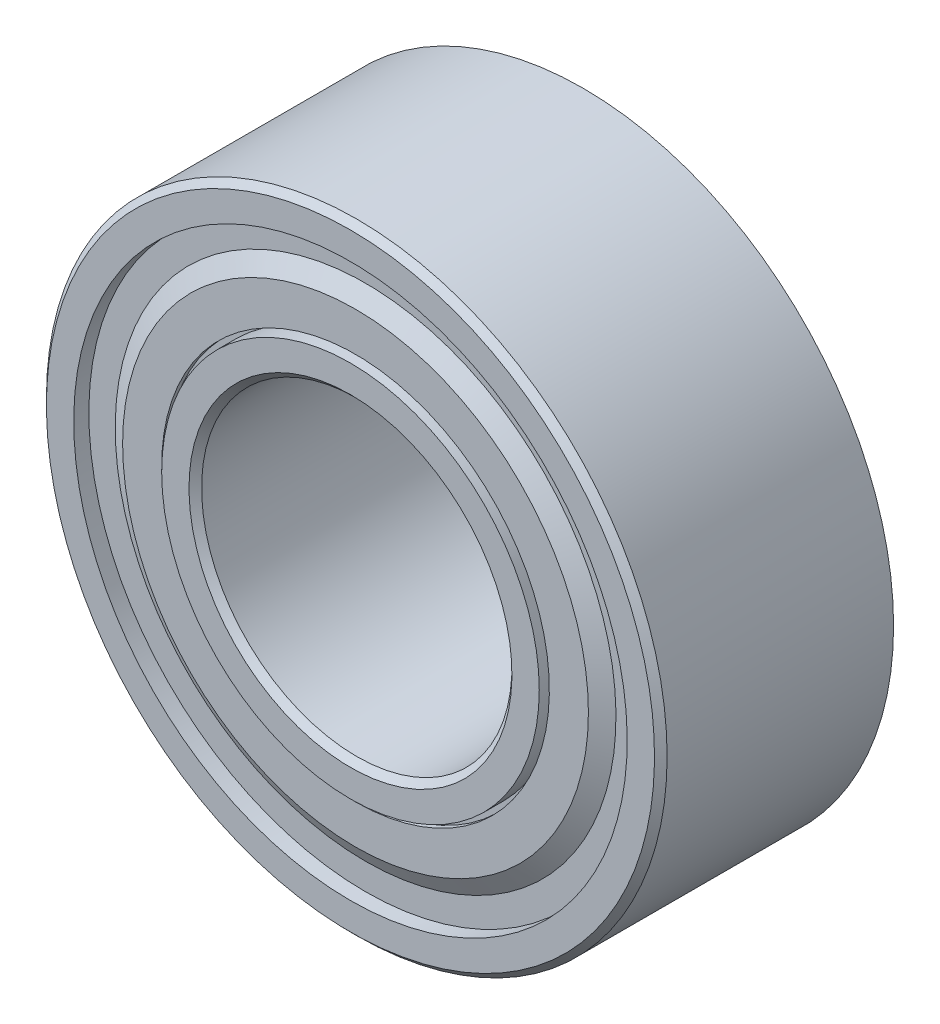
ISO-10303-21;
HEADER;
FILE_DESCRIPTION(('STEP AP214'),'2;1');
FILE_NAME('part.step','',(''),(''),'','','');
FILE_SCHEMA(('AUTOMOTIVE_DESIGN { 1 0 10303 214 1 1 1 1 }'));
ENDSEC;
DATA;
#1=APPLICATION_CONTEXT('core data for automotive mechanical design processes');
#2=APPLICATION_PROTOCOL_DEFINITION('international standard','automotive_design',2000,#1);
#3=PRODUCT_CONTEXT('',#1,'mechanical');
#4=PRODUCT('Part','Part','',(#3));
#5=PRODUCT_RELATED_PRODUCT_CATEGORY('part','',(#4));
#6=PRODUCT_DEFINITION_FORMATION('','',#4);
#7=PRODUCT_DEFINITION_CONTEXT('part definition',#1,'design');
#8=PRODUCT_DEFINITION('design','',#6,#7);
#9=PRODUCT_DEFINITION_SHAPE('','',#8);
#10=(LENGTH_UNIT() NAMED_UNIT(*) SI_UNIT(.MILLI.,.METRE.));
#11=(NAMED_UNIT(*) PLANE_ANGLE_UNIT() SI_UNIT($,.RADIAN.));
#12=(NAMED_UNIT(*) SI_UNIT($,.STERADIAN.) SOLID_ANGLE_UNIT());
#13=UNCERTAINTY_MEASURE_WITH_UNIT(LENGTH_MEASURE(1.E-05),#10,'distance_accuracy_value','');
#14=(GEOMETRIC_REPRESENTATION_CONTEXT(3) GLOBAL_UNCERTAINTY_ASSIGNED_CONTEXT((#13)) GLOBAL_UNIT_ASSIGNED_CONTEXT((#10,
#11,#12)) REPRESENTATION_CONTEXT('',''));
#15=CARTESIAN_POINT('',(0.,0.,0.));
#16=DIRECTION('',(0.,0.,1.));
#17=DIRECTION('',(1.,0.,0.));
#18=AXIS2_PLACEMENT_3D('',#15,#16,#17);
#19=CARTESIAN_POINT('',(0.,0.,0.));
#20=DIRECTION('',(0.,0.,1.));
#21=DIRECTION('',(0.,-1.,0.));
#22=AXIS2_PLACEMENT_3D('',#19,#20,#21);
#23=CYLINDRICAL_SURFACE('',#22,3.56666666666667);
#24=CARTESIAN_POINT('',(0.,0.,-1.24));
#25=DIRECTION('',(0.,0.,1.));
#26=DIRECTION('',(0.,-1.,0.));
#27=AXIS2_PLACEMENT_3D('',#24,#25,#26);
#28=CIRCLE('',#27,3.56666666666667);
#29=CARTESIAN_POINT('',(0.,-3.56666666666667,-1.24));
#30=VERTEX_POINT('',#29);
#31=EDGE_CURVE('E84',#30,#30,#28,.T.);
#32=ORIENTED_EDGE('',*,*,#31,.F.);
#33=EDGE_LOOP('',(#32));
#34=FACE_BOUND('',#33,.T.);
#35=CARTESIAN_POINT('',(0.,0.,-1.305));
#36=DIRECTION('',(0.,0.,1.));
#37=DIRECTION('',(0.,-1.,0.));
#38=AXIS2_PLACEMENT_3D('',#35,#36,#37);
#39=CIRCLE('',#38,3.56666666666667);
#40=CARTESIAN_POINT('',(0.,-3.56666666666667,-1.305));
#41=VERTEX_POINT('',#40);
#42=EDGE_CURVE('E12',#41,#41,#39,.T.);
#43=ORIENTED_EDGE('',*,*,#42,.T.);
#44=EDGE_LOOP('',(#43));
#45=FACE_BOUND('',#44,.T.);
#46=ADVANCED_FACE('F56',(#34,#45),#23,.T.);
#47=CARTESIAN_POINT('',(0.,3.56666666666667,-1.305));
#48=DIRECTION('',(0.,0.,1.));
#49=DIRECTION('',(0.,-1.,0.));
#50=AXIS2_PLACEMENT_3D('',#47,#48,#49);
#51=PLANE('',#50);
#52=ORIENTED_EDGE('',*,*,#42,.F.);
#53=EDGE_LOOP('',(#52));
#54=FACE_BOUND('',#53,.T.);
#55=CARTESIAN_POINT('',(0.,0.,-1.305));
#56=DIRECTION('',(0.,0.,1.));
#57=DIRECTION('',(0.,-1.,0.));
#58=AXIS2_PLACEMENT_3D('',#55,#56,#57);
#59=CIRCLE('',#58,3.22694050703183);
#60=CARTESIAN_POINT('',(0.,-3.22694050703183,-1.305));
#61=VERTEX_POINT('',#60);
#62=EDGE_CURVE('E62',#61,#61,#59,.T.);
#63=ORIENTED_EDGE('',*,*,#62,.T.);
#64=EDGE_LOOP('',(#63));
#65=FACE_BOUND('',#64,.T.);
#66=ADVANCED_FACE('F91',(#54,#65),#51,.F.);
#67=CARTESIAN_POINT('',(0.,0.,-1.435));
#68=DIRECTION('',(0.,0.,1.));
#69=DIRECTION('',(0.,-1.,0.));
#70=AXIS2_PLACEMENT_3D('',#67,#68,#69);
#71=CONICAL_SURFACE('',#70,3.00177390204788,1.0471975511966);
#72=ORIENTED_EDGE('',*,*,#62,.F.);
#73=EDGE_LOOP('',(#72));
#74=FACE_BOUND('',#73,.T.);
#75=CARTESIAN_POINT('',(0.,0.,-1.435));
#76=DIRECTION('',(0.,0.,1.));
#77=DIRECTION('',(0.,-1.,0.));
#78=AXIS2_PLACEMENT_3D('',#75,#76,#77);
#79=CIRCLE('',#78,3.00177390204788);
#80=CARTESIAN_POINT('',(0.,-3.00177390204788,-1.435));
#81=VERTEX_POINT('',#80);
#82=EDGE_CURVE('E66',#81,#81,#79,.T.);
#83=ORIENTED_EDGE('',*,*,#82,.T.);
#84=EDGE_LOOP('',(#83));
#85=FACE_BOUND('',#84,.T.);
#86=ADVANCED_FACE('F95',(#74,#85),#71,.T.);
#87=CARTESIAN_POINT('',(0.,3.00177390204788,-1.435));
#88=DIRECTION('',(0.,0.,1.));
#89=DIRECTION('',(0.,-1.,0.));
#90=AXIS2_PLACEMENT_3D('',#87,#88,#89);
#91=PLANE('',#90);
#92=ORIENTED_EDGE('',*,*,#82,.F.);
#93=EDGE_LOOP('',(#92));
#94=FACE_BOUND('',#93,.T.);
#95=CARTESIAN_POINT('',(0.,0.,-1.435));
#96=DIRECTION('',(0.,0.,1.));
#97=DIRECTION('',(0.,-1.,0.));
#98=AXIS2_PLACEMENT_3D('',#95,#96,#97);
#99=CIRCLE('',#98,2.49833333333333);
#100=CARTESIAN_POINT('',(0.,-2.49833333333333,-1.435));
#101=VERTEX_POINT('',#100);
#102=EDGE_CURVE('E70',#101,#101,#99,.T.);
#103=ORIENTED_EDGE('',*,*,#102,.T.);
#104=EDGE_LOOP('',(#103));
#105=FACE_BOUND('',#104,.T.);
#106=ADVANCED_FACE('F100',(#94,#105),#91,.F.);
#107=CARTESIAN_POINT('',(0.,0.,0.));
#108=DIRECTION('',(0.,0.,1.));
#109=DIRECTION('',(0.,-1.,0.));
#110=AXIS2_PLACEMENT_3D('',#107,#108,#109);
#111=CYLINDRICAL_SURFACE('',#110,2.49833333333333);
#112=ORIENTED_EDGE('',*,*,#102,.F.);
#113=EDGE_LOOP('',(#112));
#114=FACE_BOUND('',#113,.T.);
#115=CARTESIAN_POINT('',(0.,0.,-1.37));
#116=DIRECTION('',(0.,0.,1.));
#117=DIRECTION('',(0.,-1.,0.));
#118=AXIS2_PLACEMENT_3D('',#115,#116,#117);
#119=CIRCLE('',#118,2.49833333333333);
#120=CARTESIAN_POINT('',(0.,-2.49833333333333,-1.37));
#121=VERTEX_POINT('',#120);
#122=EDGE_CURVE('E75',#121,#121,#119,.T.);
#123=ORIENTED_EDGE('',*,*,#122,.T.);
#124=EDGE_LOOP('',(#123));
#125=FACE_BOUND('',#124,.T.);
#126=ADVANCED_FACE('F106',(#114,#125),#111,.F.);
#127=CARTESIAN_POINT('',(0.,2.98435720453986,-1.37));
#128=DIRECTION('',(0.,0.,-1.));
#129=DIRECTION('',(0.,1.,0.));
#130=AXIS2_PLACEMENT_3D('',#127,#128,#129);
#131=PLANE('',#130);
#132=ORIENTED_EDGE('',*,*,#122,.F.);
#133=EDGE_LOOP('',(#132));
#134=FACE_BOUND('',#133,.T.);
#135=CARTESIAN_POINT('',(0.,0.,-1.37));
#136=DIRECTION('',(0.,0.,1.));
#137=DIRECTION('',(0.,-1.,0.));
#138=AXIS2_PLACEMENT_3D('',#135,#136,#137);
#139=CIRCLE('',#138,2.98435720453986);
#140=CARTESIAN_POINT('',(0.,-2.98435720453986,-1.37));
#141=VERTEX_POINT('',#140);
#142=EDGE_CURVE('E78',#141,#141,#139,.T.);
#143=ORIENTED_EDGE('',*,*,#142,.T.);
#144=EDGE_LOOP('',(#143));
#145=FACE_BOUND('',#144,.T.);
#146=ADVANCED_FACE('F110',(#134,#145),#131,.F.);
#147=CARTESIAN_POINT('',(0.,0.,-1.24));
#148=DIRECTION('',(0.,0.,1.));
#149=DIRECTION('',(0.,-1.,0.));
#150=AXIS2_PLACEMENT_3D('',#147,#148,#149);
#151=CONICAL_SURFACE('',#150,3.20952380952381,1.0471975511966);
#152=ORIENTED_EDGE('',*,*,#142,.F.);
#153=EDGE_LOOP('',(#152));
#154=FACE_BOUND('',#153,.T.);
#155=CARTESIAN_POINT('',(0.,0.,-1.24));
#156=DIRECTION('',(0.,0.,1.));
#157=DIRECTION('',(0.,-1.,0.));
#158=AXIS2_PLACEMENT_3D('',#155,#156,#157);
#159=CIRCLE('',#158,3.20952380952381);
#160=CARTESIAN_POINT('',(0.,-3.20952380952381,-1.24));
#161=VERTEX_POINT('',#160);
#162=EDGE_CURVE('E81',#161,#161,#159,.T.);
#163=ORIENTED_EDGE('',*,*,#162,.T.);
#164=EDGE_LOOP('',(#163));
#165=FACE_BOUND('',#164,.T.);
#166=ADVANCED_FACE('F114',(#154,#165),#151,.F.);
#167=CARTESIAN_POINT('',(0.,3.56666666666667,-1.24));
#168=DIRECTION('',(0.,0.,-1.));
#169=DIRECTION('',(0.,1.,0.));
#170=AXIS2_PLACEMENT_3D('',#167,#168,#169);
#171=PLANE('',#170);
#172=ORIENTED_EDGE('',*,*,#162,.F.);
#173=EDGE_LOOP('',(#172));
#174=FACE_BOUND('',#173,.T.);
#175=ORIENTED_EDGE('',*,*,#31,.T.);
#176=EDGE_LOOP('',(#175));
#177=FACE_BOUND('',#176,.T.);
#178=ADVANCED_FACE('F88',(#174,#177),#171,.F.);
#179=CLOSED_SHELL('',(#46,#66,#86,#106,#126,#146,#166,#178));
#180=MANIFOLD_SOLID_BREP('B2',#179);
#181=CARTESIAN_POINT('',(0.,0.,0.));
#182=DIRECTION('',(0.,0.,1.));
#183=DIRECTION('',(0.,-1.,0.));
#184=AXIS2_PLACEMENT_3D('',#181,#182,#183);
#185=CYLINDRICAL_SURFACE('',#184,3.56666666666667);
#186=CARTESIAN_POINT('',(0.,0.,1.305));
#187=DIRECTION('',(0.,0.,1.));
#188=DIRECTION('',(0.,-1.,0.));
#189=AXIS2_PLACEMENT_3D('',#186,#187,#188);
#190=CIRCLE('',#189,3.56666666666667);
#191=CARTESIAN_POINT('',(0.,-3.56666666666667,1.305));
#192=VERTEX_POINT('',#191);
#193=EDGE_CURVE('E55',#192,#192,#190,.T.);
#194=ORIENTED_EDGE('',*,*,#193,.F.);
#195=EDGE_LOOP('',(#194));
#196=FACE_BOUND('',#195,.T.);
#197=CARTESIAN_POINT('',(0.,0.,1.24));
#198=DIRECTION('',(0.,0.,1.));
#199=DIRECTION('',(0.,-1.,0.));
#200=AXIS2_PLACEMENT_3D('',#197,#198,#199);
#201=CIRCLE('',#200,3.56666666666667);
#202=CARTESIAN_POINT('',(0.,-3.56666666666667,1.24));
#203=VERTEX_POINT('',#202);
#204=EDGE_CURVE('E212',#203,#203,#201,.T.);
#205=ORIENTED_EDGE('',*,*,#204,.T.);
#206=EDGE_LOOP('',(#205));
#207=FACE_BOUND('',#206,.T.);
#208=ADVANCED_FACE('F184',(#196,#207),#185,.T.);
#209=CARTESIAN_POINT('',(0.,3.56666666666667,1.305));
#210=DIRECTION('',(0.,0.,-1.));
#211=DIRECTION('',(0.,1.,0.));
#212=AXIS2_PLACEMENT_3D('',#209,#210,#211);
#213=PLANE('',#212);
#214=CARTESIAN_POINT('',(0.,0.,1.305));
#215=DIRECTION('',(0.,0.,1.));
#216=DIRECTION('',(0.,-1.,0.));
#217=AXIS2_PLACEMENT_3D('',#214,#215,#216);
#218=CIRCLE('',#217,3.22694050703183);
#219=CARTESIAN_POINT('',(0.,-3.22694050703183,1.305));
#220=VERTEX_POINT('',#219);
#221=EDGE_CURVE('E190',#220,#220,#218,.T.);
#222=ORIENTED_EDGE('',*,*,#221,.F.);
#223=EDGE_LOOP('',(#222));
#224=FACE_BOUND('',#223,.T.);
#225=ORIENTED_EDGE('',*,*,#193,.T.);
#226=EDGE_LOOP('',(#225));
#227=FACE_BOUND('',#226,.T.);
#228=ADVANCED_FACE('F249',(#224,#227),#213,.F.);
#229=CARTESIAN_POINT('',(0.,0.,1.305));
#230=DIRECTION('',(0.,0.,-1.));
#231=DIRECTION('',(0.,1.,0.));
#232=AXIS2_PLACEMENT_3D('',#229,#230,#231);
#233=CONICAL_SURFACE('',#232,3.22694050703183,1.0471975511966);
#234=CARTESIAN_POINT('',(0.,0.,1.435));
#235=DIRECTION('',(0.,0.,1.));
#236=DIRECTION('',(0.,-1.,0.));
#237=AXIS2_PLACEMENT_3D('',#234,#235,#236);
#238=CIRCLE('',#237,3.00177390204788);
#239=CARTESIAN_POINT('',(0.,-3.00177390204788,1.435));
#240=VERTEX_POINT('',#239);
#241=EDGE_CURVE('E194',#240,#240,#238,.T.);
#242=ORIENTED_EDGE('',*,*,#241,.F.);
#243=EDGE_LOOP('',(#242));
#244=FACE_BOUND('',#243,.T.);
#245=ORIENTED_EDGE('',*,*,#221,.T.);
#246=EDGE_LOOP('',(#245));
#247=FACE_BOUND('',#246,.T.);
#248=ADVANCED_FACE('F244',(#244,#247),#233,.T.);
#249=CARTESIAN_POINT('',(0.,3.00177390204788,1.435));
#250=DIRECTION('',(0.,0.,-1.));
#251=DIRECTION('',(0.,1.,0.));
#252=AXIS2_PLACEMENT_3D('',#249,#250,#251);
#253=PLANE('',#252);
#254=CARTESIAN_POINT('',(0.,0.,1.435));
#255=DIRECTION('',(0.,0.,1.));
#256=DIRECTION('',(0.,-1.,0.));
#257=AXIS2_PLACEMENT_3D('',#254,#255,#256);
#258=CIRCLE('',#257,2.49833333333333);
#259=CARTESIAN_POINT('',(0.,-2.49833333333333,1.435));
#260=VERTEX_POINT('',#259);
#261=EDGE_CURVE('E198',#260,#260,#258,.T.);
#262=ORIENTED_EDGE('',*,*,#261,.F.);
#263=EDGE_LOOP('',(#262));
#264=FACE_BOUND('',#263,.T.);
#265=ORIENTED_EDGE('',*,*,#241,.T.);
#266=EDGE_LOOP('',(#265));
#267=FACE_BOUND('',#266,.T.);
#268=ADVANCED_FACE('F238',(#264,#267),#253,.F.);
#269=CARTESIAN_POINT('',(0.,0.,0.));
#270=DIRECTION('',(0.,0.,1.));
#271=DIRECTION('',(0.,-1.,0.));
#272=AXIS2_PLACEMENT_3D('',#269,#270,#271);
#273=CYLINDRICAL_SURFACE('',#272,2.49833333333333);
#274=CARTESIAN_POINT('',(0.,0.,1.37));
#275=DIRECTION('',(0.,0.,1.));
#276=DIRECTION('',(0.,-1.,0.));
#277=AXIS2_PLACEMENT_3D('',#274,#275,#276);
#278=CIRCLE('',#277,2.49833333333333);
#279=CARTESIAN_POINT('',(0.,-2.49833333333333,1.37));
#280=VERTEX_POINT('',#279);
#281=EDGE_CURVE('E203',#280,#280,#278,.T.);
#282=ORIENTED_EDGE('',*,*,#281,.F.);
#283=EDGE_LOOP('',(#282));
#284=FACE_BOUND('',#283,.T.);
#285=ORIENTED_EDGE('',*,*,#261,.T.);
#286=EDGE_LOOP('',(#285));
#287=FACE_BOUND('',#286,.T.);
#288=ADVANCED_FACE('F232',(#284,#287),#273,.F.);
#289=CARTESIAN_POINT('',(0.,2.98435720453986,1.37));
#290=DIRECTION('',(0.,0.,1.));
#291=DIRECTION('',(0.,-1.,0.));
#292=AXIS2_PLACEMENT_3D('',#289,#290,#291);
#293=PLANE('',#292);
#294=CARTESIAN_POINT('',(0.,0.,1.37));
#295=DIRECTION('',(0.,0.,1.));
#296=DIRECTION('',(0.,-1.,0.));
#297=AXIS2_PLACEMENT_3D('',#294,#295,#296);
#298=CIRCLE('',#297,2.98435720453986);
#299=CARTESIAN_POINT('',(0.,-2.98435720453986,1.37));
#300=VERTEX_POINT('',#299);
#301=EDGE_CURVE('E206',#300,#300,#298,.T.);
#302=ORIENTED_EDGE('',*,*,#301,.F.);
#303=EDGE_LOOP('',(#302));
#304=FACE_BOUND('',#303,.T.);
#305=ORIENTED_EDGE('',*,*,#281,.T.);
#306=EDGE_LOOP('',(#305));
#307=FACE_BOUND('',#306,.T.);
#308=ADVANCED_FACE('F226',(#304,#307),#293,.F.);
#309=CARTESIAN_POINT('',(0.,0.,1.37));
#310=DIRECTION('',(0.,0.,-1.));
#311=DIRECTION('',(0.,1.,0.));
#312=AXIS2_PLACEMENT_3D('',#309,#310,#311);
#313=CONICAL_SURFACE('',#312,2.98435720453986,1.0471975511966);
#314=CARTESIAN_POINT('',(0.,0.,1.24));
#315=DIRECTION('',(0.,0.,1.));
#316=DIRECTION('',(0.,-1.,0.));
#317=AXIS2_PLACEMENT_3D('',#314,#315,#316);
#318=CIRCLE('',#317,3.20952380952381);
#319=CARTESIAN_POINT('',(0.,-3.20952380952381,1.24));
#320=VERTEX_POINT('',#319);
#321=EDGE_CURVE('E209',#320,#320,#318,.T.);
#322=ORIENTED_EDGE('',*,*,#321,.F.);
#323=EDGE_LOOP('',(#322));
#324=FACE_BOUND('',#323,.T.);
#325=ORIENTED_EDGE('',*,*,#301,.T.);
#326=EDGE_LOOP('',(#325));
#327=FACE_BOUND('',#326,.T.);
#328=ADVANCED_FACE('F220',(#324,#327),#313,.F.);
#329=CARTESIAN_POINT('',(0.,3.56666666666667,1.24));
#330=DIRECTION('',(0.,0.,1.));
#331=DIRECTION('',(0.,-1.,0.));
#332=AXIS2_PLACEMENT_3D('',#329,#330,#331);
#333=PLANE('',#332);
#334=ORIENTED_EDGE('',*,*,#204,.F.);
#335=EDGE_LOOP('',(#334));
#336=FACE_BOUND('',#335,.T.);
#337=ORIENTED_EDGE('',*,*,#321,.T.);
#338=EDGE_LOOP('',(#337));
#339=FACE_BOUND('',#338,.T.);
#340=ADVANCED_FACE('F217',(#336,#339),#333,.F.);
#341=CLOSED_SHELL('',(#208,#228,#248,#268,#288,#308,#328,#340));
#342=MANIFOLD_SOLID_BREP('B7',#341);
#343=CARTESIAN_POINT('',(-1.49999999999997,2.59807621135334,0.));
#344=DIRECTION('',(-0.499999999999989,0.866025403784445,0.));
#345=DIRECTION('',(0.866025403784445,0.499999999999989,0.));
#346=AXIS2_PLACEMENT_3D('',#343,#344,#345);
#347=SPHERICAL_SURFACE('',#346,0.6);
#348=CARTESIAN_POINT('',(-1.79999999999996,3.117691453624,0.));
#349=VERTEX_POINT('',#348);
#350=VERTEX_LOOP('',#349);
#351=FACE_BOUND('',#350,.T.);
#352=ADVANCED_FACE('F312',(#351),#347,.T.);
#353=CLOSED_SHELL('',(#352));
#354=MANIFOLD_SOLID_BREP('B50',#353);
#355=CARTESIAN_POINT('',(-2.5980762113533,1.50000000000003,0.));
#356=DIRECTION('',(-0.866025403784433,0.50000000000001,0.));
#357=DIRECTION('',(0.50000000000001,0.866025403784433,0.));
#358=AXIS2_PLACEMENT_3D('',#355,#356,#357);
#359=SPHERICAL_SURFACE('',#358,0.6);
#360=CARTESIAN_POINT('',(-3.11769145362396,1.80000000000004,0.));
#361=VERTEX_POINT('',#360);
#362=VERTEX_LOOP('',#361);
#363=FACE_BOUND('',#362,.T.);
#364=ADVANCED_FACE('F331',(#363),#359,.T.);
#365=CLOSED_SHELL('',(#364));
#366=MANIFOLD_SOLID_BREP('B180',#365);
#367=CARTESIAN_POINT('',(-3.,0.,0.));
#368=DIRECTION('',(-1.,0.,0.));
#369=DIRECTION('',(0.,1.,0.));
#370=AXIS2_PLACEMENT_3D('',#367,#368,#369);
#371=SPHERICAL_SURFACE('',#370,0.6);
#372=CARTESIAN_POINT('',(-3.6,0.,0.));
#373=VERTEX_POINT('',#372);
#374=VERTEX_LOOP('',#373);
#375=FACE_BOUND('',#374,.T.);
#376=ADVANCED_FACE('F350',(#375),#371,.T.);
#377=CLOSED_SHELL('',(#376));
#378=MANIFOLD_SOLID_BREP('B308',#377);
#379=CARTESIAN_POINT('',(-2.59807621135333,-1.49999999999998,0.));
#380=DIRECTION('',(-0.866025403784443,-0.499999999999992,0.));
#381=DIRECTION('',(-0.499999999999992,0.866025403784443,0.));
#382=AXIS2_PLACEMENT_3D('',#379,#380,#381);
#383=SPHERICAL_SURFACE('',#382,0.6);
#384=CARTESIAN_POINT('',(-3.117691453624,-1.79999999999997,0.));
#385=VERTEX_POINT('',#384);
#386=VERTEX_LOOP('',#385);
#387=FACE_BOUND('',#386,.T.);
#388=ADVANCED_FACE('F369',(#387),#383,.T.);
#389=CLOSED_SHELL('',(#388));
#390=MANIFOLD_SOLID_BREP('B327',#389);
#391=CARTESIAN_POINT('',(-1.50000000000002,-2.5980762113533,0.));
#392=DIRECTION('',(-0.500000000000007,-0.866025403784435,0.));
#393=DIRECTION('',(-0.866025403784435,0.500000000000007,0.));
#394=AXIS2_PLACEMENT_3D('',#391,#392,#393);
#395=SPHERICAL_SURFACE('',#394,0.6);
#396=CARTESIAN_POINT('',(-1.80000000000003,-3.11769145362396,0.));
#397=VERTEX_POINT('',#396);
#398=VERTEX_LOOP('',#397);
#399=FACE_BOUND('',#398,.T.);
#400=ADVANCED_FACE('F388',(#399),#395,.T.);
#401=CLOSED_SHELL('',(#400));
#402=MANIFOLD_SOLID_BREP('B346',#401);
#403=CARTESIAN_POINT('',(0.,-3.,0.));
#404=DIRECTION('',(0.,-1.,0.));
#405=DIRECTION('',(-1.,0.,0.));
#406=AXIS2_PLACEMENT_3D('',#403,#404,#405);
#407=SPHERICAL_SURFACE('',#406,0.6);
#408=CARTESIAN_POINT('',(0.,-3.6,0.));
#409=VERTEX_POINT('',#408);
#410=VERTEX_LOOP('',#409);
#411=FACE_BOUND('',#410,.T.);
#412=ADVANCED_FACE('F407',(#411),#407,.T.);
#413=CLOSED_SHELL('',(#412));
#414=MANIFOLD_SOLID_BREP('B365',#413);
#415=CARTESIAN_POINT('',(1.49999999999998,-2.59807621135332,0.));
#416=DIRECTION('',(0.499999999999995,-0.866025403784442,0.));
#417=DIRECTION('',(-0.866025403784442,-0.499999999999995,0.));
#418=AXIS2_PLACEMENT_3D('',#415,#416,#417);
#419=SPHERICAL_SURFACE('',#418,0.6);
#420=CARTESIAN_POINT('',(1.79999999999998,-3.11769145362399,0.));
#421=VERTEX_POINT('',#420);
#422=VERTEX_LOOP('',#421);
#423=FACE_BOUND('',#422,.T.);
#424=ADVANCED_FACE('F426',(#423),#419,.T.);
#425=CLOSED_SHELL('',(#424));
#426=MANIFOLD_SOLID_BREP('B384',#425);
#427=CARTESIAN_POINT('',(2.59807621135331,-1.50000000000001,0.));
#428=DIRECTION('',(0.866025403784436,-0.500000000000004,0.));
#429=DIRECTION('',(-0.500000000000004,-0.866025403784436,0.));
#430=AXIS2_PLACEMENT_3D('',#427,#428,#429);
#431=SPHERICAL_SURFACE('',#430,0.6);
#432=CARTESIAN_POINT('',(3.11769145362397,-1.80000000000001,0.));
#433=VERTEX_POINT('',#432);
#434=VERTEX_LOOP('',#433);
#435=FACE_BOUND('',#434,.T.);
#436=ADVANCED_FACE('F445',(#435),#431,.T.);
#437=CLOSED_SHELL('',(#436));
#438=MANIFOLD_SOLID_BREP('B403',#437);
#439=CARTESIAN_POINT('',(3.,0.,0.));
#440=DIRECTION('',(1.,0.,0.));
#441=DIRECTION('',(0.,-1.,0.));
#442=AXIS2_PLACEMENT_3D('',#439,#440,#441);
#443=SPHERICAL_SURFACE('',#442,0.6);
#444=CARTESIAN_POINT('',(3.6,0.,0.));
#445=VERTEX_POINT('',#444);
#446=VERTEX_LOOP('',#445);
#447=FACE_BOUND('',#446,.T.);
#448=ADVANCED_FACE('F464',(#447),#443,.T.);
#449=CLOSED_SHELL('',(#448));
#450=MANIFOLD_SOLID_BREP('B422',#449);
#451=CARTESIAN_POINT('',(2.59807621135332,1.49999999999999,0.));
#452=DIRECTION('',(0.86602540378444,0.499999999999998,0.));
#453=DIRECTION('',(0.499999999999998,-0.86602540378444,0.));
#454=AXIS2_PLACEMENT_3D('',#451,#452,#453);
#455=SPHERICAL_SURFACE('',#454,0.6);
#456=CARTESIAN_POINT('',(3.11769145362398,1.79999999999999,0.));
#457=VERTEX_POINT('',#456);
#458=VERTEX_LOOP('',#457);
#459=FACE_BOUND('',#458,.T.);
#460=ADVANCED_FACE('F483',(#459),#455,.T.);
#461=CLOSED_SHELL('',(#460));
#462=MANIFOLD_SOLID_BREP('B441',#461);
#463=CARTESIAN_POINT('',(1.5,2.59807621135331,0.));
#464=DIRECTION('',(0.500000000000001,0.866025403784438,0.));
#465=DIRECTION('',(0.866025403784438,-0.500000000000001,0.));
#466=AXIS2_PLACEMENT_3D('',#463,#464,#465);
#467=SPHERICAL_SURFACE('',#466,0.6);
#468=CARTESIAN_POINT('',(1.8,3.11769145362398,0.));
#469=VERTEX_POINT('',#468);
#470=VERTEX_LOOP('',#469);
#471=FACE_BOUND('',#470,.T.);
#472=ADVANCED_FACE('F502',(#471),#467,.T.);
#473=CLOSED_SHELL('',(#472));
#474=MANIFOLD_SOLID_BREP('B460',#473);
#475=CARTESIAN_POINT('',(0.,3.,0.));
#476=DIRECTION('',(0.,1.,0.));
#477=DIRECTION('',(1.,0.,0.));
#478=AXIS2_PLACEMENT_3D('',#475,#476,#477);
#479=SPHERICAL_SURFACE('',#478,0.6);
#480=CARTESIAN_POINT('',(0.,3.6,0.));
#481=VERTEX_POINT('',#480);
#482=VERTEX_LOOP('',#481);
#483=FACE_BOUND('',#482,.T.);
#484=ADVANCED_FACE('F523',(#483),#479,.T.);
#485=CLOSED_SHELL('',(#484));
#486=MANIFOLD_SOLID_BREP('B479',#485);
#487=CARTESIAN_POINT('',(0.,0.,-0.634834957055046));
#488=DIRECTION('',(0.,0.,1.));
#489=DIRECTION('',(0.,-1.,0.));
#490=AXIS2_PLACEMENT_3D('',#487,#488,#489);
#491=PLANE('',#490);
#492=CARTESIAN_POINT('',(0.,0.,-0.634834957055046));
#493=DIRECTION('',(0.,0.,1.));
#494=DIRECTION('',(0.,-1.,0.));
#495=AXIS2_PLACEMENT_3D('',#492,#493,#494);
#496=CIRCLE('',#495,2.65);
#497=CARTESIAN_POINT('',(0.,-2.65,-0.634834957055046));
#498=VERTEX_POINT('',#497);
#499=EDGE_CURVE('E597',#498,#498,#496,.T.);
#500=ORIENTED_EDGE('',*,*,#499,.F.);
#501=EDGE_LOOP('',(#500));
#502=FACE_BOUND('',#501,.T.);
#503=CARTESIAN_POINT('',(0.,0.,-0.634834957055046));
#504=DIRECTION('',(0.,0.,1.));
#505=DIRECTION('',(0.,-1.,0.));
#506=AXIS2_PLACEMENT_3D('',#503,#504,#505);
#507=CIRCLE('',#506,3.35);
#508=CARTESIAN_POINT('',(0.,-3.35,-0.634834957055046));
#509=VERTEX_POINT('',#508);
#510=EDGE_CURVE('E541',#509,#509,#507,.T.);
#511=ORIENTED_EDGE('',*,*,#510,.T.);
#512=EDGE_LOOP('',(#511));
#513=FACE_BOUND('',#512,.T.);
#514=ADVANCED_FACE('F537',(#502,#513),#491,.T.);
#515=CARTESIAN_POINT('',(0.,0.,0.));
#516=DIRECTION('',(0.,0.,1.));
#517=DIRECTION('',(0.,-1.,0.));
#518=AXIS2_PLACEMENT_3D('',#515,#516,#517);
#519=CYLINDRICAL_SURFACE('',#518,2.65);
#520=CARTESIAN_POINT('',(0.,0.,0.487339717240448));
#521=DIRECTION('',(0.,0.,1.));
#522=DIRECTION('',(0.,-1.,0.));
#523=AXIS2_PLACEMENT_3D('',#520,#521,#522);
#524=CIRCLE('',#523,2.65);
#525=CARTESIAN_POINT('',(0.,-2.65,0.487339717240448));
#526=VERTEX_POINT('',#525);
#527=EDGE_CURVE('E565',#526,#526,#524,.T.);
#528=ORIENTED_EDGE('',*,*,#527,.T.);
#529=EDGE_LOOP('',(#528));
#530=FACE_BOUND('',#529,.T.);
#531=CARTESIAN_POINT('',(0.,0.,1.24));
#532=DIRECTION('',(0.,0.,1.));
#533=DIRECTION('',(0.,-1.,0.));
#534=AXIS2_PLACEMENT_3D('',#531,#532,#533);
#535=CIRCLE('',#534,2.65);
#536=CARTESIAN_POINT('',(0.,-2.65,1.24));
#537=VERTEX_POINT('',#536);
#538=EDGE_CURVE('E589',#537,#537,#535,.T.);
#539=ORIENTED_EDGE('',*,*,#538,.F.);
#540=EDGE_LOOP('',(#539));
#541=FACE_BOUND('',#540,.T.);
#542=ADVANCED_FACE('F670',(#530,#541),#519,.T.);
#543=CARTESIAN_POINT('',(0.,2.,1.5));
#544=DIRECTION('',(0.,0.,-1.));
#545=DIRECTION('',(0.,1.,0.));
#546=AXIS2_PLACEMENT_3D('',#543,#544,#545);
#547=PLANE('',#546);
#548=CARTESIAN_POINT('',(0.,0.,1.5));
#549=DIRECTION('',(0.,0.,-1.));
#550=DIRECTION('',(0.,1.,0.));
#551=AXIS2_PLACEMENT_3D('',#548,#549,#550);
#552=CIRCLE('',#551,2.08125);
#553=CARTESIAN_POINT('',(0.,2.08125,1.5));
#554=VERTEX_POINT('',#553);
#555=EDGE_CURVE('E522',#554,#554,#552,.T.);
#556=ORIENTED_EDGE('',*,*,#555,.T.);
#557=EDGE_LOOP('',(#556));
#558=FACE_BOUND('',#557,.T.);
#559=CARTESIAN_POINT('',(0.,0.,1.5));
#560=DIRECTION('',(0.,0.,1.));
#561=DIRECTION('',(0.,-1.,0.));
#562=AXIS2_PLACEMENT_3D('',#559,#560,#561);
#563=CIRCLE('',#562,2.43333333333333);
#564=CARTESIAN_POINT('',(0.,-2.43333333333333,1.5));
#565=VERTEX_POINT('',#564);
#566=EDGE_CURVE('E581',#565,#565,#563,.T.);
#567=ORIENTED_EDGE('',*,*,#566,.T.);
#568=EDGE_LOOP('',(#567));
#569=FACE_BOUND('',#568,.T.);
#570=ADVANCED_FACE('F678',(#558,#569),#547,.F.);
#571=CARTESIAN_POINT('',(0.,0.,0.));
#572=DIRECTION('',(0.,0.,1.));
#573=DIRECTION('',(0.,-1.,0.));
#574=AXIS2_PLACEMENT_3D('',#571,#572,#573);
#575=CYLINDRICAL_SURFACE('',#574,2.65);
#576=ORIENTED_EDGE('',*,*,#499,.T.);
#577=EDGE_LOOP('',(#576));
#578=FACE_BOUND('',#577,.T.);
#579=CARTESIAN_POINT('',(0.,0.,-0.487339717240449));
#580=DIRECTION('',(0.,0.,1.));
#581=DIRECTION('',(0.,-1.,0.));
#582=AXIS2_PLACEMENT_3D('',#579,#580,#581);
#583=CIRCLE('',#582,2.65);
#584=CARTESIAN_POINT('',(0.,-2.65,-0.487339717240449));
#585=VERTEX_POINT('',#584);
#586=EDGE_CURVE('E561',#585,#585,#583,.T.);
#587=ORIENTED_EDGE('',*,*,#586,.F.);
#588=EDGE_LOOP('',(#587));
#589=FACE_BOUND('',#588,.T.);
#590=ADVANCED_FACE('F720',(#578,#589),#575,.T.);
#591=CARTESIAN_POINT('',(0.,0.,0.));
#592=DIRECTION('',(0.,0.,1.));
#593=DIRECTION('',(0.,-1.,0.));
#594=AXIS2_PLACEMENT_3D('',#591,#592,#593);
#595=TOROIDAL_SURFACE('',#594,3.,0.6);
#596=ORIENTED_EDGE('',*,*,#527,.F.);
#597=EDGE_LOOP('',(#596));
#598=FACE_BOUND('',#597,.T.);
#599=ORIENTED_EDGE('',*,*,#586,.T.);
#600=EDGE_LOOP('',(#599));
#601=FACE_BOUND('',#600,.T.);
#602=ADVANCED_FACE('F717',(#598,#601),#595,.F.);
#603=CARTESIAN_POINT('',(0.,0.,0.));
#604=DIRECTION('',(0.,0.,1.));
#605=DIRECTION('',(0.,-1.,0.));
#606=AXIS2_PLACEMENT_3D('',#603,#604,#605);
#607=CYLINDRICAL_SURFACE('',#606,2.);
#608=CARTESIAN_POINT('',(0.,0.,1.41875));
#609=DIRECTION('',(0.,0.,-1.));
#610=DIRECTION('',(0.,1.,0.));
#611=AXIS2_PLACEMENT_3D('',#608,#609,#610);
#612=CIRCLE('',#611,2.);
#613=CARTESIAN_POINT('',(0.,2.,1.41875));
#614=VERTEX_POINT('',#613);
#615=EDGE_CURVE('E551',#614,#614,#612,.F.);
#616=ORIENTED_EDGE('',*,*,#615,.T.);
#617=EDGE_LOOP('',(#616));
#618=FACE_BOUND('',#617,.T.);
#619=CARTESIAN_POINT('',(0.,0.,-1.41875));
#620=DIRECTION('',(0.,0.,1.));
#621=DIRECTION('',(0.,-1.,0.));
#622=AXIS2_PLACEMENT_3D('',#619,#620,#621);
#623=CIRCLE('',#622,2.);
#624=CARTESIAN_POINT('',(0.,-2.,-1.41875));
#625=VERTEX_POINT('',#624);
#626=EDGE_CURVE('E546',#625,#625,#623,.F.);
#627=ORIENTED_EDGE('',*,*,#626,.T.);
#628=EDGE_LOOP('',(#627));
#629=FACE_BOUND('',#628,.T.);
#630=ADVANCED_FACE('F715',(#618,#629),#607,.F.);
#631=CARTESIAN_POINT('',(0.,0.,1.41875));
#632=DIRECTION('',(0.,0.,1.));
#633=DIRECTION('',(0.,-1.,0.));
#634=AXIS2_PLACEMENT_3D('',#631,#632,#633);
#635=CONICAL_SURFACE('',#634,2.,0.78539816339745);
#636=ORIENTED_EDGE('',*,*,#555,.F.);
#637=EDGE_LOOP('',(#636));
#638=FACE_BOUND('',#637,.T.);
#639=ORIENTED_EDGE('',*,*,#615,.F.);
#640=EDGE_LOOP('',(#639));
#641=FACE_BOUND('',#640,.T.);
#642=ADVANCED_FACE('F539',(#638,#641),#635,.F.);
#643=CARTESIAN_POINT('',(0.,0.,0.));
#644=DIRECTION('',(0.,0.,1.));
#645=DIRECTION('',(0.,-1.,0.));
#646=AXIS2_PLACEMENT_3D('',#643,#644,#645);
#647=CYLINDRICAL_SURFACE('',#646,2.43333333333333);
#648=CARTESIAN_POINT('',(0.,0.,1.24));
#649=DIRECTION('',(0.,0.,1.));
#650=DIRECTION('',(0.,-1.,0.));
#651=AXIS2_PLACEMENT_3D('',#648,#649,#650);
#652=CIRCLE('',#651,2.43333333333333);
#653=CARTESIAN_POINT('',(0.,-2.43333333333333,1.24));
#654=VERTEX_POINT('',#653);
#655=EDGE_CURVE('E585',#654,#654,#652,.T.);
#656=ORIENTED_EDGE('',*,*,#655,.T.);
#657=EDGE_LOOP('',(#656));
#658=FACE_BOUND('',#657,.T.);
#659=ORIENTED_EDGE('',*,*,#566,.F.);
#660=EDGE_LOOP('',(#659));
#661=FACE_BOUND('',#660,.T.);
#662=ADVANCED_FACE('F697',(#658,#661),#647,.T.);
#663=CARTESIAN_POINT('',(0.,2.65,1.24));
#664=DIRECTION('',(0.,0.,1.));
#665=DIRECTION('',(0.,-1.,0.));
#666=AXIS2_PLACEMENT_3D('',#663,#664,#665);
#667=PLANE('',#666);
#668=ORIENTED_EDGE('',*,*,#538,.T.);
#669=EDGE_LOOP('',(#668));
#670=FACE_BOUND('',#669,.T.);
#671=ORIENTED_EDGE('',*,*,#655,.F.);
#672=EDGE_LOOP('',(#671));
#673=FACE_BOUND('',#672,.T.);
#674=ADVANCED_FACE('F693',(#670,#673),#667,.T.);
#675=CARTESIAN_POINT('',(0.,3.35,1.24));
#676=DIRECTION('',(0.,0.,1.));
#677=DIRECTION('',(0.,-1.,0.));
#678=AXIS2_PLACEMENT_3D('',#675,#676,#677);
#679=PLANE('',#678);
#680=CARTESIAN_POINT('',(0.,0.,1.24));
#681=DIRECTION('',(0.,0.,1.));
#682=DIRECTION('',(0.,-1.,0.));
#683=AXIS2_PLACEMENT_3D('',#680,#681,#682);
#684=CIRCLE('',#683,3.56666666666667);
#685=CARTESIAN_POINT('',(0.,-3.56666666666667,1.24));
#686=VERTEX_POINT('',#685);
#687=EDGE_CURVE('E625',#686,#686,#684,.T.);
#688=ORIENTED_EDGE('',*,*,#687,.T.);
#689=EDGE_LOOP('',(#688));
#690=FACE_BOUND('',#689,.T.);
#691=CARTESIAN_POINT('',(0.,0.,1.24));
#692=DIRECTION('',(0.,0.,1.));
#693=DIRECTION('',(0.,-1.,0.));
#694=AXIS2_PLACEMENT_3D('',#691,#692,#693);
#695=CIRCLE('',#694,3.35);
#696=CARTESIAN_POINT('',(0.,-3.35,1.24));
#697=VERTEX_POINT('',#696);
#698=EDGE_CURVE('E629',#697,#697,#695,.T.);
#699=ORIENTED_EDGE('',*,*,#698,.F.);
#700=EDGE_LOOP('',(#699));
#701=FACE_BOUND('',#700,.T.);
#702=ADVANCED_FACE('F696',(#690,#701),#679,.T.);
#703=CARTESIAN_POINT('',(0.,0.,0.));
#704=DIRECTION('',(0.,0.,1.));
#705=DIRECTION('',(0.,-1.,0.));
#706=AXIS2_PLACEMENT_3D('',#703,#704,#705);
#707=CYLINDRICAL_SURFACE('',#706,3.56666666666667);
#708=CARTESIAN_POINT('',(0.,0.,1.5));
#709=DIRECTION('',(0.,0.,1.));
#710=DIRECTION('',(0.,-1.,0.));
#711=AXIS2_PLACEMENT_3D('',#708,#709,#710);
#712=CIRCLE('',#711,3.56666666666667);
#713=CARTESIAN_POINT('',(0.,-3.56666666666667,1.5));
#714=VERTEX_POINT('',#713);
#715=EDGE_CURVE('E621',#714,#714,#712,.T.);
#716=ORIENTED_EDGE('',*,*,#715,.T.);
#717=EDGE_LOOP('',(#716));
#718=FACE_BOUND('',#717,.T.);
#719=ORIENTED_EDGE('',*,*,#687,.F.);
#720=EDGE_LOOP('',(#719));
#721=FACE_BOUND('',#720,.T.);
#722=ADVANCED_FACE('F837',(#718,#721),#707,.F.);
#723=CARTESIAN_POINT('',(0.,0.,1.5));
#724=DIRECTION('',(0.,0.,-1.));
#725=DIRECTION('',(0.,1.,0.));
#726=AXIS2_PLACEMENT_3D('',#723,#724,#725);
#727=CONICAL_SURFACE('',#726,3.91875,0.785398163397447);
#728=CARTESIAN_POINT('',(0.,0.,1.41875));
#729=DIRECTION('',(0.,0.,-1.));
#730=DIRECTION('',(0.,1.,0.));
#731=AXIS2_PLACEMENT_3D('',#728,#729,#730);
#732=CIRCLE('',#731,4.);
#733=CARTESIAN_POINT('',(0.,4.,1.41875));
#734=VERTEX_POINT('',#733);
#735=EDGE_CURVE('E605',#734,#734,#732,.T.);
#736=ORIENTED_EDGE('',*,*,#735,.F.);
#737=EDGE_LOOP('',(#736));
#738=FACE_BOUND('',#737,.T.);
#739=CARTESIAN_POINT('',(0.,0.,1.5));
#740=DIRECTION('',(0.,0.,-1.));
#741=DIRECTION('',(0.,1.,0.));
#742=AXIS2_PLACEMENT_3D('',#739,#740,#741);
#743=CIRCLE('',#742,3.91875);
#744=CARTESIAN_POINT('',(0.,3.91875,1.5));
#745=VERTEX_POINT('',#744);
#746=EDGE_CURVE('E609',#745,#745,#743,.F.);
#747=ORIENTED_EDGE('',*,*,#746,.F.);
#748=EDGE_LOOP('',(#747));
#749=FACE_BOUND('',#748,.T.);
#750=ADVANCED_FACE('F684',(#738,#749),#727,.T.);
#751=CARTESIAN_POINT('',(0.,0.,0.));
#752=DIRECTION('',(0.,0.,1.));
#753=DIRECTION('',(0.,-1.,0.));
#754=AXIS2_PLACEMENT_3D('',#751,#752,#753);
#755=TOROIDAL_SURFACE('',#754,3.,0.6);
#756=CARTESIAN_POINT('',(0.,0.,-0.487339717240449));
#757=DIRECTION('',(0.,0.,1.));
#758=DIRECTION('',(0.,-1.,0.));
#759=AXIS2_PLACEMENT_3D('',#756,#757,#758);
#760=CIRCLE('',#759,3.35);
#761=CARTESIAN_POINT('',(0.,-3.35,-0.48733971724045));
#762=VERTEX_POINT('',#761);
#763=EDGE_CURVE('E613',#762,#762,#760,.T.);
#764=ORIENTED_EDGE('',*,*,#763,.F.);
#765=EDGE_LOOP('',(#764));
#766=FACE_BOUND('',#765,.T.);
#767=CARTESIAN_POINT('',(0.,0.,0.487339717240448));
#768=DIRECTION('',(0.,0.,1.));
#769=DIRECTION('',(0.,-1.,0.));
#770=AXIS2_PLACEMENT_3D('',#767,#768,#769);
#771=CIRCLE('',#770,3.35);
#772=CARTESIAN_POINT('',(0.,-3.35,0.487339717240448));
#773=VERTEX_POINT('',#772);
#774=EDGE_CURVE('E617',#773,#773,#771,.T.);
#775=ORIENTED_EDGE('',*,*,#774,.T.);
#776=EDGE_LOOP('',(#775));
#777=FACE_BOUND('',#776,.T.);
#778=ADVANCED_FACE('F820',(#766,#777),#755,.F.);
#779=CARTESIAN_POINT('',(0.,4.,1.5));
#780=DIRECTION('',(0.,0.,-1.));
#781=DIRECTION('',(0.,1.,0.));
#782=AXIS2_PLACEMENT_3D('',#779,#780,#781);
#783=PLANE('',#782);
#784=ORIENTED_EDGE('',*,*,#746,.T.);
#785=EDGE_LOOP('',(#784));
#786=FACE_BOUND('',#785,.T.);
#787=ORIENTED_EDGE('',*,*,#715,.F.);
#788=EDGE_LOOP('',(#787));
#789=FACE_BOUND('',#788,.T.);
#790=ADVANCED_FACE('F811',(#786,#789),#783,.F.);
#791=CARTESIAN_POINT('',(0.,0.,0.));
#792=DIRECTION('',(0.,0.,1.));
#793=DIRECTION('',(0.,-1.,0.));
#794=AXIS2_PLACEMENT_3D('',#791,#792,#793);
#795=CYLINDRICAL_SURFACE('',#794,3.35);
#796=ORIENTED_EDGE('',*,*,#774,.F.);
#797=EDGE_LOOP('',(#796));
#798=FACE_BOUND('',#797,.T.);
#799=ORIENTED_EDGE('',*,*,#698,.T.);
#800=EDGE_LOOP('',(#799));
#801=FACE_BOUND('',#800,.T.);
#802=ADVANCED_FACE('F804',(#798,#801),#795,.F.);
#803=CARTESIAN_POINT('',(0.,0.,0.));
#804=DIRECTION('',(0.,0.,1.));
#805=DIRECTION('',(0.,-1.,0.));
#806=AXIS2_PLACEMENT_3D('',#803,#804,#805);
#807=CYLINDRICAL_SURFACE('',#806,3.35);
#808=ORIENTED_EDGE('',*,*,#510,.F.);
#809=EDGE_LOOP('',(#808));
#810=FACE_BOUND('',#809,.T.);
#811=ORIENTED_EDGE('',*,*,#763,.T.);
#812=EDGE_LOOP('',(#811));
#813=FACE_BOUND('',#812,.T.);
#814=ADVANCED_FACE('F667',(#810,#813),#807,.F.);
#815=CARTESIAN_POINT('',(0.,0.,-12.3462910204572));
#816=DIRECTION('',(0.,0.,1.));
#817=DIRECTION('',(1.,0.,0.));
#818=AXIS2_PLACEMENT_3D('',#815,#816,#817);
#819=CYLINDRICAL_SURFACE('',#818,4.);
#820=ORIENTED_EDGE('',*,*,#735,.T.);
#821=EDGE_LOOP('',(#820));
#822=FACE_BOUND('',#821,.T.);
#823=CARTESIAN_POINT('',(0.,0.,-1.5));
#824=DIRECTION('',(0.,0.,1.));
#825=DIRECTION('',(1.,0.,0.));
#826=AXIS2_PLACEMENT_3D('',#823,#824,#825);
#827=CIRCLE('',#826,4.);
#828=CARTESIAN_POINT('',(4.,0.,-1.5));
#829=VERTEX_POINT('',#828);
#830=EDGE_CURVE('E645',#829,#829,#827,.T.);
#831=ORIENTED_EDGE('',*,*,#830,.T.);
#832=EDGE_LOOP('',(#831));
#833=FACE_BOUND('',#832,.T.);
#834=ADVANCED_FACE('F650',(#822,#833),#819,.T.);
#835=CARTESIAN_POINT('',(0.,0.,-1.03258252147248));
#836=DIRECTION('',(0.,0.,-1.));
#837=DIRECTION('',(0.,1.,0.));
#838=AXIS2_PLACEMENT_3D('',#835,#836,#837);
#839=CIRCLE('',#838,3.35);
#840=CARTESIAN_POINT('',(0.,3.35,-1.03258252147248));
#841=VERTEX_POINT('',#840);
#842=EDGE_CURVE('E601',#841,#841,#839,.T.);
#843=ORIENTED_EDGE('',*,*,#842,.F.);
#844=EDGE_LOOP('',(#843));
#845=FACE_BOUND('',#844,.T.);
#846=CARTESIAN_POINT('',(0.,0.,-1.24));
#847=DIRECTION('',(0.,0.,1.));
#848=DIRECTION('',(0.,-1.,0.));
#849=AXIS2_PLACEMENT_3D('',#846,#847,#848);
#850=CIRCLE('',#849,3.35);
#851=CARTESIAN_POINT('',(0.,-3.35,-1.24));
#852=VERTEX_POINT('',#851);
#853=EDGE_CURVE('E641',#852,#852,#850,.T.);
#854=ORIENTED_EDGE('',*,*,#853,.F.);
#855=EDGE_LOOP('',(#854));
#856=FACE_BOUND('',#855,.T.);
#857=ADVANCED_FACE('F655',(#845,#856),#807,.F.);
#858=CARTESIAN_POINT('',(0.,3.35,-1.5));
#859=DIRECTION('',(0.,0.,1.));
#860=DIRECTION('',(0.,-1.,0.));
#861=AXIS2_PLACEMENT_3D('',#858,#859,#860);
#862=PLANE('',#861);
#863=CARTESIAN_POINT('',(0.,0.,-1.5));
#864=DIRECTION('',(0.,0.,1.));
#865=DIRECTION('',(0.,-1.,0.));
#866=AXIS2_PLACEMENT_3D('',#863,#864,#865);
#867=CIRCLE('',#866,3.56666666666667);
#868=CARTESIAN_POINT('',(0.,-3.56666666666667,-1.5));
#869=VERTEX_POINT('',#868);
#870=EDGE_CURVE('E633',#869,#869,#867,.T.);
#871=ORIENTED_EDGE('',*,*,#870,.T.);
#872=EDGE_LOOP('',(#871));
#873=FACE_BOUND('',#872,.T.);
#874=ORIENTED_EDGE('',*,*,#830,.F.);
#875=EDGE_LOOP('',(#874));
#876=FACE_BOUND('',#875,.T.);
#877=ADVANCED_FACE('F652',(#873,#876),#862,.F.);
#878=CARTESIAN_POINT('',(0.,0.,0.));
#879=DIRECTION('',(0.,0.,1.));
#880=DIRECTION('',(0.,-1.,0.));
#881=AXIS2_PLACEMENT_3D('',#878,#879,#880);
#882=CYLINDRICAL_SURFACE('',#881,3.56666666666667);
#883=CARTESIAN_POINT('',(0.,0.,-1.24));
#884=DIRECTION('',(0.,0.,1.));
#885=DIRECTION('',(0.,-1.,0.));
#886=AXIS2_PLACEMENT_3D('',#883,#884,#885);
#887=CIRCLE('',#886,3.56666666666667);
#888=CARTESIAN_POINT('',(0.,-3.56666666666667,-1.24));
#889=VERTEX_POINT('',#888);
#890=EDGE_CURVE('E637',#889,#889,#887,.T.);
#891=ORIENTED_EDGE('',*,*,#890,.T.);
#892=EDGE_LOOP('',(#891));
#893=FACE_BOUND('',#892,.T.);
#894=ORIENTED_EDGE('',*,*,#870,.F.);
#895=EDGE_LOOP('',(#894));
#896=FACE_BOUND('',#895,.T.);
#897=ADVANCED_FACE('F654',(#893,#896),#882,.F.);
#898=CARTESIAN_POINT('',(0.,3.35,-1.24));
#899=DIRECTION('',(0.,0.,-1.));
#900=DIRECTION('',(0.,1.,0.));
#901=AXIS2_PLACEMENT_3D('',#898,#899,#900);
#902=PLANE('',#901);
#903=ORIENTED_EDGE('',*,*,#853,.T.);
#904=EDGE_LOOP('',(#903));
#905=FACE_BOUND('',#904,.T.);
#906=ORIENTED_EDGE('',*,*,#890,.F.);
#907=EDGE_LOOP('',(#906));
#908=FACE_BOUND('',#907,.T.);
#909=ADVANCED_FACE('F662',(#905,#908),#902,.T.);
#910=CARTESIAN_POINT('',(0.,0.,-1.5));
#911=DIRECTION('',(0.,0.,-1.));
#912=DIRECTION('',(0.,1.,0.));
#913=AXIS2_PLACEMENT_3D('',#910,#911,#912);
#914=CONICAL_SURFACE('',#913,2.08125,0.78539816339745);
#915=ORIENTED_EDGE('',*,*,#626,.F.);
#916=EDGE_LOOP('',(#915));
#917=FACE_BOUND('',#916,.T.);
#918=CARTESIAN_POINT('',(0.,0.,-1.5));
#919=DIRECTION('',(0.,0.,1.));
#920=DIRECTION('',(0.,-1.,0.));
#921=AXIS2_PLACEMENT_3D('',#918,#919,#920);
#922=CIRCLE('',#921,2.08125);
#923=CARTESIAN_POINT('',(0.,-2.08125,-1.5));
#924=VERTEX_POINT('',#923);
#925=EDGE_CURVE('E557',#924,#924,#922,.T.);
#926=ORIENTED_EDGE('',*,*,#925,.F.);
#927=EDGE_LOOP('',(#926));
#928=FACE_BOUND('',#927,.T.);
#929=ADVANCED_FACE('F713',(#917,#928),#914,.F.);
#930=CARTESIAN_POINT('',(0.,2.65,-1.5));
#931=DIRECTION('',(0.,0.,1.));
#932=DIRECTION('',(0.,-1.,0.));
#933=AXIS2_PLACEMENT_3D('',#930,#931,#932);
#934=PLANE('',#933);
#935=ORIENTED_EDGE('',*,*,#925,.T.);
#936=EDGE_LOOP('',(#935));
#937=FACE_BOUND('',#936,.T.);
#938=CARTESIAN_POINT('',(0.,0.,-1.5));
#939=DIRECTION('',(0.,0.,1.));
#940=DIRECTION('',(0.,-1.,0.));
#941=AXIS2_PLACEMENT_3D('',#938,#939,#940);
#942=CIRCLE('',#941,2.43333333333333);
#943=CARTESIAN_POINT('',(0.,-2.43333333333333,-1.5));
#944=VERTEX_POINT('',#943);
#945=EDGE_CURVE('E569',#944,#944,#942,.T.);
#946=ORIENTED_EDGE('',*,*,#945,.F.);
#947=EDGE_LOOP('',(#946));
#948=FACE_BOUND('',#947,.T.);
#949=ADVANCED_FACE('F709',(#937,#948),#934,.F.);
#950=CARTESIAN_POINT('',(0.,0.,0.));
#951=DIRECTION('',(0.,0.,1.));
#952=DIRECTION('',(0.,-1.,0.));
#953=AXIS2_PLACEMENT_3D('',#950,#951,#952);
#954=CYLINDRICAL_SURFACE('',#953,2.43333333333333);
#955=ORIENTED_EDGE('',*,*,#945,.T.);
#956=EDGE_LOOP('',(#955));
#957=FACE_BOUND('',#956,.T.);
#958=CARTESIAN_POINT('',(0.,0.,-1.24));
#959=DIRECTION('',(0.,0.,1.));
#960=DIRECTION('',(0.,-1.,0.));
#961=AXIS2_PLACEMENT_3D('',#958,#959,#960);
#962=CIRCLE('',#961,2.43333333333333);
#963=CARTESIAN_POINT('',(0.,-2.43333333333333,-1.24));
#964=VERTEX_POINT('',#963);
#965=EDGE_CURVE('E573',#964,#964,#962,.T.);
#966=ORIENTED_EDGE('',*,*,#965,.F.);
#967=EDGE_LOOP('',(#966));
#968=FACE_BOUND('',#967,.T.);
#969=ADVANCED_FACE('F705',(#957,#968),#954,.T.);
#970=CARTESIAN_POINT('',(0.,2.65,-1.24));
#971=DIRECTION('',(0.,0.,-1.));
#972=DIRECTION('',(0.,1.,0.));
#973=AXIS2_PLACEMENT_3D('',#970,#971,#972);
#974=PLANE('',#973);
#975=ORIENTED_EDGE('',*,*,#965,.T.);
#976=EDGE_LOOP('',(#975));
#977=FACE_BOUND('',#976,.T.);
#978=CARTESIAN_POINT('',(0.,0.,-1.24));
#979=DIRECTION('',(0.,0.,1.));
#980=DIRECTION('',(0.,-1.,0.));
#981=AXIS2_PLACEMENT_3D('',#978,#979,#980);
#982=CIRCLE('',#981,2.65);
#983=CARTESIAN_POINT('',(0.,-2.65,-1.24));
#984=VERTEX_POINT('',#983);
#985=EDGE_CURVE('E577',#984,#984,#982,.T.);
#986=ORIENTED_EDGE('',*,*,#985,.F.);
#987=EDGE_LOOP('',(#986));
#988=FACE_BOUND('',#987,.T.);
#989=ADVANCED_FACE('F702',(#977,#988),#974,.T.);
#990=CARTESIAN_POINT('',(0.,0.,-1.03258252147248));
#991=DIRECTION('',(0.,0.,-1.));
#992=DIRECTION('',(0.,1.,0.));
#993=AXIS2_PLACEMENT_3D('',#990,#991,#992);
#994=CIRCLE('',#993,2.65);
#995=CARTESIAN_POINT('',(0.,2.65,-1.03258252147248));
#996=VERTEX_POINT('',#995);
#997=EDGE_CURVE('E593',#996,#996,#994,.T.);
#998=ORIENTED_EDGE('',*,*,#997,.T.);
#999=EDGE_LOOP('',(#998));
#1000=FACE_BOUND('',#999,.T.);
#1001=ORIENTED_EDGE('',*,*,#985,.T.);
#1002=EDGE_LOOP('',(#1001));
#1003=FACE_BOUND('',#1002,.T.);
#1004=ADVANCED_FACE('F691',(#1000,#1003),#575,.T.);
#1005=CARTESIAN_POINT('',(0.,4.13258252147248,-1.03258252147248));
#1006=DIRECTION('',(0.,0.,-1.));
#1007=DIRECTION('',(0.,1.,0.));
#1008=AXIS2_PLACEMENT_3D('',#1005,#1006,#1007);
#1009=PLANE('',#1008);
#1010=ORIENTED_EDGE('',*,*,#997,.F.);
#1011=EDGE_LOOP('',(#1010));
#1012=FACE_BOUND('',#1011,.T.);
#1013=ORIENTED_EDGE('',*,*,#842,.T.);
#1014=EDGE_LOOP('',(#1013));
#1015=FACE_BOUND('',#1014,.T.);
#1016=ADVANCED_FACE('F688',(#1012,#1015),#1009,.T.);
#1017=CLOSED_SHELL('',(#514,#542,#570,#590,#602,#630,#642,#662,#674,#702,#722,#750,#778,#790,
#802,#814,#834,#857,#877,#897,#909,#929,#949,#969,#989,#1004,#1016));
#1018=MANIFOLD_SOLID_BREP('B498',#1017);
#1019=ADVANCED_BREP_SHAPE_REPRESENTATION('',(#18,#180,#342,#354,#366,#378,#390,#402,#414,#426,
#438,#450,#462,#474,#486,#1018),#14);
#1020=SHAPE_DEFINITION_REPRESENTATION(#9,#1019);
ENDSEC;
END-ISO-10303-21;
